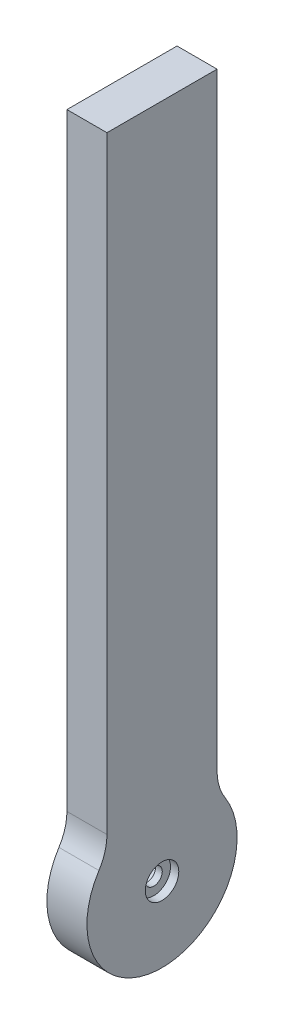
ISO-10303-21;
HEADER;
FILE_DESCRIPTION(('STEP AP214'),'2;1');
FILE_NAME('part.step','',(''),(''),'','','');
FILE_SCHEMA(('AUTOMOTIVE_DESIGN { 1 0 10303 214 1 1 1 1 }'));
ENDSEC;
DATA;
#1=APPLICATION_CONTEXT('core data for automotive mechanical design processes');
#2=APPLICATION_PROTOCOL_DEFINITION('international standard','automotive_design',2000,#1);
#3=PRODUCT_CONTEXT('',#1,'mechanical');
#4=PRODUCT('Part','Part','',(#3));
#5=PRODUCT_RELATED_PRODUCT_CATEGORY('part','',(#4));
#6=PRODUCT_DEFINITION_FORMATION('','',#4);
#7=PRODUCT_DEFINITION_CONTEXT('part definition',#1,'design');
#8=PRODUCT_DEFINITION('design','',#6,#7);
#9=PRODUCT_DEFINITION_SHAPE('','',#8);
#10=(LENGTH_UNIT() NAMED_UNIT(*) SI_UNIT(.MILLI.,.METRE.));
#11=(NAMED_UNIT(*) PLANE_ANGLE_UNIT() SI_UNIT($,.RADIAN.));
#12=(NAMED_UNIT(*) SI_UNIT($,.STERADIAN.) SOLID_ANGLE_UNIT());
#13=UNCERTAINTY_MEASURE_WITH_UNIT(LENGTH_MEASURE(1.E-05),#10,'distance_accuracy_value','');
#14=(GEOMETRIC_REPRESENTATION_CONTEXT(3) GLOBAL_UNCERTAINTY_ASSIGNED_CONTEXT((#13)) GLOBAL_UNIT_ASSIGNED_CONTEXT((#10,
#11,#12)) REPRESENTATION_CONTEXT('',''));
#15=CARTESIAN_POINT('',(0.,0.,0.));
#16=DIRECTION('',(0.,0.,1.));
#17=DIRECTION('',(1.,0.,0.));
#18=AXIS2_PLACEMENT_3D('',#15,#16,#17);
#19=CARTESIAN_POINT('',(8.,0.,0.));
#20=DIRECTION('',(-1.,0.,0.));
#21=DIRECTION('',(0.,0.,1.));
#22=AXIS2_PLACEMENT_3D('',#19,#20,#21);
#23=PLANE('',#22);
#24=DIRECTION('',(0.,1.,0.));
#25=VECTOR('',#24,1.);
#26=CARTESIAN_POINT('',(8.,150.,-33.));
#27=LINE('',#26,#25);
#28=CARTESIAN_POINT('',(8.,28.5646599662505,-33.));
#29=VERTEX_POINT('',#28);
#30=CARTESIAN_POINT('',(8.,150.,-33.));
#31=VERTEX_POINT('',#30);
#32=EDGE_CURVE('E131',#29,#31,#27,.T.);
#33=ORIENTED_EDGE('',*,*,#32,.T.);
#34=DIRECTION('',(0.,0.,-1.));
#35=VECTOR('',#34,1.);
#36=CARTESIAN_POINT('',(8.,150.,0.));
#37=LINE('',#36,#35);
#38=CARTESIAN_POINT('',(8.,150.,-11.));
#39=VERTEX_POINT('',#38);
#40=EDGE_CURVE('E43',#39,#31,#37,.T.);
#41=ORIENTED_EDGE('',*,*,#40,.F.);
#42=DIRECTION('',(0.,-1.,0.));
#43=VECTOR('',#42,1.);
#44=CARTESIAN_POINT('',(8.,150.,-11.));
#45=LINE('',#44,#43);
#46=CARTESIAN_POINT('',(8.,28.5646599662505,-11.));
#47=VERTEX_POINT('',#46);
#48=EDGE_CURVE('E128',#39,#47,#45,.T.);
#49=ORIENTED_EDGE('',*,*,#48,.T.);
#50=CARTESIAN_POINT('',(8.,28.5646599662505,-1.00000000000001));
#51=DIRECTION('',(-1.,0.,0.));
#52=DIRECTION('',(0.,0.,1.));
#53=AXIS2_PLACEMENT_3D('',#50,#51,#52);
#54=CIRCLE('',#53,10.);
#55=CARTESIAN_POINT('',(8.,23.1387959797503,-9.40000000000002));
#56=VERTEX_POINT('',#55);
#57=EDGE_CURVE('E146',#47,#56,#54,.T.);
#58=ORIENTED_EDGE('',*,*,#57,.T.);
#59=CARTESIAN_POINT('',(8.,15.,-22.));
#60=DIRECTION('',(-1.,0.,0.));
#61=DIRECTION('',(0.,0.,1.));
#62=AXIS2_PLACEMENT_3D('',#59,#60,#61);
#63=CIRCLE('',#62,15.);
#64=CARTESIAN_POINT('',(8.,23.1387959797503,-34.6));
#65=VERTEX_POINT('',#64);
#66=EDGE_CURVE('E11',#65,#56,#63,.T.);
#67=ORIENTED_EDGE('',*,*,#66,.F.);
#68=CARTESIAN_POINT('',(8.,28.5646599662505,-43.));
#69=DIRECTION('',(-1.,0.,0.));
#70=DIRECTION('',(0.,0.,-1.));
#71=AXIS2_PLACEMENT_3D('',#68,#69,#70);
#72=CIRCLE('',#71,9.99999999999999);
#73=EDGE_CURVE('E148',#65,#29,#72,.T.);
#74=ORIENTED_EDGE('',*,*,#73,.T.);
#75=EDGE_LOOP('',(#33,#41,#49,#58,#67,#74));
#76=FACE_BOUND('',#75,.T.);
#77=CARTESIAN_POINT('',(8.,15.,-22.));
#78=DIRECTION('',(1.,0.,0.));
#79=DIRECTION('',(0.,0.,-1.));
#80=AXIS2_PLACEMENT_3D('',#77,#78,#79);
#81=CIRCLE('',#80,3.35);
#82=CARTESIAN_POINT('',(8.,15.,-25.35));
#83=VERTEX_POINT('',#82);
#84=EDGE_CURVE('E236',#83,#83,#81,.T.);
#85=ORIENTED_EDGE('',*,*,#84,.F.);
#86=EDGE_LOOP('',(#85));
#87=FACE_BOUND('',#86,.T.);
#88=ADVANCED_FACE('F35',(#76,#87),#23,.F.);
#89=CARTESIAN_POINT('',(0.,0.,0.));
#90=DIRECTION('',(-1.,0.,0.));
#91=DIRECTION('',(0.,0.,1.));
#92=AXIS2_PLACEMENT_3D('',#89,#90,#91);
#93=PLANE('',#92);
#94=DIRECTION('',(0.,0.,-1.));
#95=VECTOR('',#94,1.);
#96=CARTESIAN_POINT('',(0.,150.,0.));
#97=LINE('',#96,#95);
#98=CARTESIAN_POINT('',(0.,150.,-11.));
#99=VERTEX_POINT('',#98);
#100=CARTESIAN_POINT('',(0.,150.,-33.));
#101=VERTEX_POINT('',#100);
#102=EDGE_CURVE('E134',#99,#101,#97,.T.);
#103=ORIENTED_EDGE('',*,*,#102,.T.);
#104=DIRECTION('',(0.,1.,0.));
#105=VECTOR('',#104,1.);
#106=CARTESIAN_POINT('',(0.,150.,-33.));
#107=LINE('',#106,#105);
#108=CARTESIAN_POINT('',(0.,28.5646599662505,-33.));
#109=VERTEX_POINT('',#108);
#110=EDGE_CURVE('E50',#109,#101,#107,.T.);
#111=ORIENTED_EDGE('',*,*,#110,.F.);
#112=CARTESIAN_POINT('',(0.,28.5646599662505,-43.));
#113=DIRECTION('',(-1.,0.,0.));
#114=DIRECTION('',(0.,0.,1.));
#115=AXIS2_PLACEMENT_3D('',#112,#113,#114);
#116=CIRCLE('',#115,9.99999999999999);
#117=CARTESIAN_POINT('',(0.,23.1387959797503,-34.6));
#118=VERTEX_POINT('',#117);
#119=EDGE_CURVE('E150',#118,#109,#116,.T.);
#120=ORIENTED_EDGE('',*,*,#119,.F.);
#121=CARTESIAN_POINT('',(0.,15.,-22.));
#122=DIRECTION('',(-1.,0.,0.));
#123=DIRECTION('',(0.,0.,1.));
#124=AXIS2_PLACEMENT_3D('',#121,#122,#123);
#125=CIRCLE('',#124,15.);
#126=CARTESIAN_POINT('',(0.,23.1387959797503,-9.40000000000002));
#127=VERTEX_POINT('',#126);
#128=EDGE_CURVE('E58',#127,#118,#125,.F.);
#129=ORIENTED_EDGE('',*,*,#128,.F.);
#130=CARTESIAN_POINT('',(0.,28.5646599662505,-1.00000000000001));
#131=DIRECTION('',(-1.,0.,0.));
#132=DIRECTION('',(0.,0.,1.));
#133=AXIS2_PLACEMENT_3D('',#130,#131,#132);
#134=CIRCLE('',#133,10.);
#135=CARTESIAN_POINT('',(0.,28.5646599662505,-11.));
#136=VERTEX_POINT('',#135);
#137=EDGE_CURVE('E222',#136,#127,#134,.T.);
#138=ORIENTED_EDGE('',*,*,#137,.F.);
#139=DIRECTION('',(0.,-1.,0.));
#140=VECTOR('',#139,1.);
#141=CARTESIAN_POINT('',(0.,150.,-11.));
#142=LINE('',#141,#140);
#143=EDGE_CURVE('E158',#99,#136,#142,.T.);
#144=ORIENTED_EDGE('',*,*,#143,.F.);
#145=EDGE_LOOP('',(#103,#111,#120,#129,#138,#144));
#146=FACE_BOUND('',#145,.T.);
#147=DIRECTION('',(0.,1.,0.));
#148=VECTOR('',#147,1.);
#149=CARTESIAN_POINT('',(0.,13.,-25.4641016151378));
#150=LINE('',#149,#148);
#151=CARTESIAN_POINT('',(0.,13.,-25.4641016151378));
#152=VERTEX_POINT('',#151);
#153=CARTESIAN_POINT('',(0.,17.,-25.4641016151378));
#154=VERTEX_POINT('',#153);
#155=EDGE_CURVE('E174',#152,#154,#150,.T.);
#156=ORIENTED_EDGE('',*,*,#155,.T.);
#157=DIRECTION('',(0.,0.5,0.866025403784439));
#158=VECTOR('',#157,1.);
#159=CARTESIAN_POINT('',(0.,17.,-25.4641016151378));
#160=LINE('',#159,#158);
#161=CARTESIAN_POINT('',(0.,19.,-22.));
#162=VERTEX_POINT('',#161);
#163=EDGE_CURVE('E169',#154,#162,#160,.T.);
#164=ORIENTED_EDGE('',*,*,#163,.T.);
#165=DIRECTION('',(0.,-0.499999999999999,0.866025403784439));
#166=VECTOR('',#165,1.);
#167=CARTESIAN_POINT('',(0.,19.,-22.));
#168=LINE('',#167,#166);
#169=CARTESIAN_POINT('',(0.,17.,-18.5358983848622));
#170=VERTEX_POINT('',#169);
#171=EDGE_CURVE('E187',#162,#170,#168,.T.);
#172=ORIENTED_EDGE('',*,*,#171,.T.);
#173=DIRECTION('',(0.,-1.,0.));
#174=VECTOR('',#173,1.);
#175=CARTESIAN_POINT('',(0.,17.,-18.5358983848622));
#176=LINE('',#175,#174);
#177=CARTESIAN_POINT('',(0.,13.,-18.5358983848622));
#178=VERTEX_POINT('',#177);
#179=EDGE_CURVE('E190',#170,#178,#176,.T.);
#180=ORIENTED_EDGE('',*,*,#179,.T.);
#181=DIRECTION('',(0.,-0.500000000000001,-0.866025403784438));
#182=VECTOR('',#181,1.);
#183=CARTESIAN_POINT('',(0.,13.,-18.5358983848622));
#184=LINE('',#183,#182);
#185=CARTESIAN_POINT('',(0.,11.,-22.));
#186=VERTEX_POINT('',#185);
#187=EDGE_CURVE('E193',#178,#186,#184,.T.);
#188=ORIENTED_EDGE('',*,*,#187,.T.);
#189=DIRECTION('',(0.,0.499999999999999,-0.866025403784439));
#190=VECTOR('',#189,1.);
#191=CARTESIAN_POINT('',(0.,11.,-22.));
#192=LINE('',#191,#190);
#193=EDGE_CURVE('E196',#186,#152,#192,.T.);
#194=ORIENTED_EDGE('',*,*,#193,.T.);
#195=EDGE_LOOP('',(#156,#164,#172,#180,#188,#194));
#196=FACE_BOUND('',#195,.T.);
#197=ADVANCED_FACE('F213',(#146,#196),#93,.T.);
#198=CARTESIAN_POINT('',(8.,150.,0.));
#199=DIRECTION('',(0.,1.,0.));
#200=DIRECTION('',(0.,0.,1.));
#201=AXIS2_PLACEMENT_3D('',#198,#199,#200);
#202=PLANE('',#201);
#203=ORIENTED_EDGE('',*,*,#40,.T.);
#204=DIRECTION('',(1.,0.,0.));
#205=VECTOR('',#204,1.);
#206=CARTESIAN_POINT('',(-0.000999999999999265,150.,-33.));
#207=LINE('',#206,#205);
#208=EDGE_CURVE('E156',#101,#31,#207,.T.);
#209=ORIENTED_EDGE('',*,*,#208,.F.);
#210=ORIENTED_EDGE('',*,*,#102,.F.);
#211=DIRECTION('',(1.,0.,0.));
#212=VECTOR('',#211,1.);
#213=CARTESIAN_POINT('',(-0.000999999999999265,150.,-11.));
#214=LINE('',#213,#212);
#215=EDGE_CURVE('E138',#99,#39,#214,.T.);
#216=ORIENTED_EDGE('',*,*,#215,.T.);
#217=EDGE_LOOP('',(#203,#209,#210,#216));
#218=FACE_BOUND('',#217,.T.);
#219=ADVANCED_FACE('F37',(#218),#202,.T.);
#220=CARTESIAN_POINT('',(5.,17.,-25.4641016151378));
#221=DIRECTION('',(0.,-0.866025403784439,0.5));
#222=DIRECTION('',(0.,-0.5,-0.866025403784439));
#223=AXIS2_PLACEMENT_3D('',#220,#221,#222);
#224=PLANE('',#223);
#225=ORIENTED_EDGE('',*,*,#163,.F.);
#226=DIRECTION('',(-1.,0.,0.));
#227=VECTOR('',#226,1.);
#228=CARTESIAN_POINT('',(5.,17.,-25.4641016151378));
#229=LINE('',#228,#227);
#230=CARTESIAN_POINT('',(5.,17.,-25.4641016151378));
#231=VERTEX_POINT('',#230);
#232=EDGE_CURVE('E184',#231,#154,#229,.T.);
#233=ORIENTED_EDGE('',*,*,#232,.F.);
#234=DIRECTION('',(0.,0.5,0.866025403784439));
#235=VECTOR('',#234,1.);
#236=CARTESIAN_POINT('',(5.,17.,-25.4641016151378));
#237=LINE('',#236,#235);
#238=CARTESIAN_POINT('',(5.,19.,-22.));
#239=VERTEX_POINT('',#238);
#240=EDGE_CURVE('E170',#231,#239,#237,.T.);
#241=ORIENTED_EDGE('',*,*,#240,.T.);
#242=DIRECTION('',(-1.,0.,0.));
#243=VECTOR('',#242,1.);
#244=CARTESIAN_POINT('',(5.,19.,-22.));
#245=LINE('',#244,#243);
#246=EDGE_CURVE('E211',#239,#162,#245,.T.);
#247=ORIENTED_EDGE('',*,*,#246,.T.);
#248=EDGE_LOOP('',(#225,#233,#241,#247));
#249=FACE_BOUND('',#248,.T.);
#250=ADVANCED_FACE('F247',(#249),#224,.T.);
#251=CARTESIAN_POINT('',(5.,19.,-22.));
#252=DIRECTION('',(0.,-0.866025403784439,-0.499999999999999));
#253=DIRECTION('',(0.,0.499999999999999,-0.866025403784439));
#254=AXIS2_PLACEMENT_3D('',#251,#252,#253);
#255=PLANE('',#254);
#256=ORIENTED_EDGE('',*,*,#171,.F.);
#257=ORIENTED_EDGE('',*,*,#246,.F.);
#258=DIRECTION('',(0.,-0.499999999999999,0.866025403784439));
#259=VECTOR('',#258,1.);
#260=CARTESIAN_POINT('',(5.,19.,-22.));
#261=LINE('',#260,#259);
#262=CARTESIAN_POINT('',(5.,17.,-18.5358983848622));
#263=VERTEX_POINT('',#262);
#264=EDGE_CURVE('E173',#239,#263,#261,.T.);
#265=ORIENTED_EDGE('',*,*,#264,.T.);
#266=DIRECTION('',(-1.,0.,0.));
#267=VECTOR('',#266,1.);
#268=CARTESIAN_POINT('',(5.,17.,-18.5358983848622));
#269=LINE('',#268,#267);
#270=EDGE_CURVE('E209',#263,#170,#269,.T.);
#271=ORIENTED_EDGE('',*,*,#270,.T.);
#272=EDGE_LOOP('',(#256,#257,#265,#271));
#273=FACE_BOUND('',#272,.T.);
#274=ADVANCED_FACE('F250',(#273),#255,.T.);
#275=CARTESIAN_POINT('',(5.,17.,-18.5358983848622));
#276=DIRECTION('',(0.,0.,-1.));
#277=DIRECTION('',(0.,1.,0.));
#278=AXIS2_PLACEMENT_3D('',#275,#276,#277);
#279=PLANE('',#278);
#280=ORIENTED_EDGE('',*,*,#179,.F.);
#281=ORIENTED_EDGE('',*,*,#270,.F.);
#282=DIRECTION('',(0.,-1.,0.));
#283=VECTOR('',#282,1.);
#284=CARTESIAN_POINT('',(5.,17.,-18.5358983848622));
#285=LINE('',#284,#283);
#286=CARTESIAN_POINT('',(5.,13.,-18.5358983848622));
#287=VERTEX_POINT('',#286);
#288=EDGE_CURVE('E176',#263,#287,#285,.T.);
#289=ORIENTED_EDGE('',*,*,#288,.T.);
#290=DIRECTION('',(-1.,0.,0.));
#291=VECTOR('',#290,1.);
#292=CARTESIAN_POINT('',(5.,13.,-18.5358983848622));
#293=LINE('',#292,#291);
#294=EDGE_CURVE('E207',#287,#178,#293,.T.);
#295=ORIENTED_EDGE('',*,*,#294,.T.);
#296=EDGE_LOOP('',(#280,#281,#289,#295));
#297=FACE_BOUND('',#296,.T.);
#298=ADVANCED_FACE('F254',(#297),#279,.T.);
#299=CARTESIAN_POINT('',(5.,13.,-18.5358983848622));
#300=DIRECTION('',(0.,0.866025403784438,-0.500000000000001));
#301=DIRECTION('',(0.,0.500000000000001,0.866025403784438));
#302=AXIS2_PLACEMENT_3D('',#299,#300,#301);
#303=PLANE('',#302);
#304=ORIENTED_EDGE('',*,*,#187,.F.);
#305=ORIENTED_EDGE('',*,*,#294,.F.);
#306=DIRECTION('',(0.,-0.500000000000001,-0.866025403784438));
#307=VECTOR('',#306,1.);
#308=CARTESIAN_POINT('',(5.,13.,-18.5358983848622));
#309=LINE('',#308,#307);
#310=CARTESIAN_POINT('',(5.,11.,-22.));
#311=VERTEX_POINT('',#310);
#312=EDGE_CURVE('E178',#287,#311,#309,.T.);
#313=ORIENTED_EDGE('',*,*,#312,.T.);
#314=DIRECTION('',(-1.,0.,0.));
#315=VECTOR('',#314,1.);
#316=CARTESIAN_POINT('',(5.,11.,-22.));
#317=LINE('',#316,#315);
#318=EDGE_CURVE('E205',#311,#186,#317,.T.);
#319=ORIENTED_EDGE('',*,*,#318,.T.);
#320=EDGE_LOOP('',(#304,#305,#313,#319));
#321=FACE_BOUND('',#320,.T.);
#322=ADVANCED_FACE('F258',(#321),#303,.T.);
#323=CARTESIAN_POINT('',(5.,11.,-22.));
#324=DIRECTION('',(0.,0.866025403784439,0.499999999999999));
#325=DIRECTION('',(0.,-0.499999999999999,0.866025403784439));
#326=AXIS2_PLACEMENT_3D('',#323,#324,#325);
#327=PLANE('',#326);
#328=ORIENTED_EDGE('',*,*,#193,.F.);
#329=ORIENTED_EDGE('',*,*,#318,.F.);
#330=DIRECTION('',(0.,0.499999999999999,-0.866025403784439));
#331=VECTOR('',#330,1.);
#332=CARTESIAN_POINT('',(5.,11.,-22.));
#333=LINE('',#332,#331);
#334=CARTESIAN_POINT('',(5.,13.,-25.4641016151378));
#335=VERTEX_POINT('',#334);
#336=EDGE_CURVE('E180',#311,#335,#333,.T.);
#337=ORIENTED_EDGE('',*,*,#336,.T.);
#338=DIRECTION('',(-1.,0.,0.));
#339=VECTOR('',#338,1.);
#340=CARTESIAN_POINT('',(5.,13.,-25.4641016151378));
#341=LINE('',#340,#339);
#342=EDGE_CURVE('E203',#335,#152,#341,.T.);
#343=ORIENTED_EDGE('',*,*,#342,.T.);
#344=EDGE_LOOP('',(#328,#329,#337,#343));
#345=FACE_BOUND('',#344,.T.);
#346=ADVANCED_FACE('F262',(#345),#327,.T.);
#347=CARTESIAN_POINT('',(5.,13.,-25.4641016151378));
#348=DIRECTION('',(0.,0.,1.));
#349=DIRECTION('',(0.,-1.,0.));
#350=AXIS2_PLACEMENT_3D('',#347,#348,#349);
#351=PLANE('',#350);
#352=ORIENTED_EDGE('',*,*,#155,.F.);
#353=ORIENTED_EDGE('',*,*,#342,.F.);
#354=DIRECTION('',(0.,1.,0.));
#355=VECTOR('',#354,1.);
#356=CARTESIAN_POINT('',(5.,13.,-25.4641016151378));
#357=LINE('',#356,#355);
#358=EDGE_CURVE('E182',#335,#231,#357,.T.);
#359=ORIENTED_EDGE('',*,*,#358,.T.);
#360=ORIENTED_EDGE('',*,*,#232,.T.);
#361=EDGE_LOOP('',(#352,#353,#359,#360));
#362=FACE_BOUND('',#361,.T.);
#363=ADVANCED_FACE('F266',(#362),#351,.T.);
#364=CARTESIAN_POINT('',(5.,0.,0.));
#365=DIRECTION('',(1.,0.,0.));
#366=DIRECTION('',(0.,0.,-1.));
#367=AXIS2_PLACEMENT_3D('',#364,#365,#366);
#368=PLANE('',#367);
#369=CARTESIAN_POINT('',(5.,15.,-22.));
#370=DIRECTION('',(1.,0.,0.));
#371=DIRECTION('',(0.,0.,-1.));
#372=AXIS2_PLACEMENT_3D('',#369,#370,#371);
#373=CIRCLE('',#372,1.7);
#374=CARTESIAN_POINT('',(5.,15.,-23.7));
#375=VERTEX_POINT('',#374);
#376=EDGE_CURVE('E227',#375,#375,#373,.T.);
#377=ORIENTED_EDGE('',*,*,#376,.T.);
#378=EDGE_LOOP('',(#377));
#379=FACE_BOUND('',#378,.T.);
#380=ORIENTED_EDGE('',*,*,#240,.F.);
#381=ORIENTED_EDGE('',*,*,#358,.F.);
#382=ORIENTED_EDGE('',*,*,#336,.F.);
#383=ORIENTED_EDGE('',*,*,#312,.F.);
#384=ORIENTED_EDGE('',*,*,#288,.F.);
#385=ORIENTED_EDGE('',*,*,#264,.F.);
#386=EDGE_LOOP('',(#380,#381,#382,#383,#384,#385));
#387=FACE_BOUND('',#386,.T.);
#388=ADVANCED_FACE('F270',(#379,#387),#368,.F.);
#389=CARTESIAN_POINT('',(-0.000999999999999265,15.,-22.));
#390=DIRECTION('',(1.,0.,0.));
#391=DIRECTION('',(0.,0.,-1.));
#392=AXIS2_PLACEMENT_3D('',#389,#390,#391);
#393=CYLINDRICAL_SURFACE('',#392,15.);
#394=ORIENTED_EDGE('',*,*,#128,.T.);
#395=DIRECTION('',(1.,0.,0.));
#396=VECTOR('',#395,1.);
#397=CARTESIAN_POINT('',(-0.000999999999999265,23.1387959797503,-34.6));
#398=LINE('',#397,#396);
#399=EDGE_CURVE('E162',#118,#65,#398,.T.);
#400=ORIENTED_EDGE('',*,*,#399,.T.);
#401=ORIENTED_EDGE('',*,*,#66,.T.);
#402=DIRECTION('',(1.,0.,0.));
#403=VECTOR('',#402,1.);
#404=CARTESIAN_POINT('',(-0.000999999999999265,23.1387959797503,-9.40000000000002));
#405=LINE('',#404,#403);
#406=EDGE_CURVE('E164',#127,#56,#405,.T.);
#407=ORIENTED_EDGE('',*,*,#406,.F.);
#408=EDGE_LOOP('',(#394,#400,#401,#407));
#409=FACE_BOUND('',#408,.T.);
#410=ADVANCED_FACE('F274',(#409),#393,.T.);
#411=CARTESIAN_POINT('',(-0.000999999999999265,150.,-33.));
#412=DIRECTION('',(0.,0.,-1.));
#413=DIRECTION('',(0.,1.,0.));
#414=AXIS2_PLACEMENT_3D('',#411,#412,#413);
#415=PLANE('',#414);
#416=DIRECTION('',(1.,0.,0.));
#417=VECTOR('',#416,1.);
#418=CARTESIAN_POINT('',(-0.000999999999999265,28.5646599662505,-33.));
#419=LINE('',#418,#417);
#420=EDGE_CURVE('E159',#109,#29,#419,.T.);
#421=ORIENTED_EDGE('',*,*,#420,.F.);
#422=ORIENTED_EDGE('',*,*,#110,.T.);
#423=ORIENTED_EDGE('',*,*,#208,.T.);
#424=ORIENTED_EDGE('',*,*,#32,.F.);
#425=EDGE_LOOP('',(#421,#422,#423,#424));
#426=FACE_BOUND('',#425,.T.);
#427=ADVANCED_FACE('F217',(#426),#415,.T.);
#428=CARTESIAN_POINT('',(-0.000999999999999265,28.5646599662505,-43.));
#429=DIRECTION('',(1.,0.,0.));
#430=DIRECTION('',(0.,0.,-1.));
#431=AXIS2_PLACEMENT_3D('',#428,#429,#430);
#432=CYLINDRICAL_SURFACE('',#431,9.99999999999999);
#433=ORIENTED_EDGE('',*,*,#399,.F.);
#434=ORIENTED_EDGE('',*,*,#119,.T.);
#435=ORIENTED_EDGE('',*,*,#420,.T.);
#436=ORIENTED_EDGE('',*,*,#73,.F.);
#437=EDGE_LOOP('',(#433,#434,#435,#436));
#438=FACE_BOUND('',#437,.T.);
#439=ADVANCED_FACE('F221',(#438),#432,.F.);
#440=CARTESIAN_POINT('',(-0.000999999999999265,28.5646599662505,-1.00000000000001));
#441=DIRECTION('',(1.,0.,0.));
#442=DIRECTION('',(0.,0.,-1.));
#443=AXIS2_PLACEMENT_3D('',#440,#441,#442);
#444=CYLINDRICAL_SURFACE('',#443,10.);
#445=DIRECTION('',(1.,0.,0.));
#446=VECTOR('',#445,1.);
#447=CARTESIAN_POINT('',(-0.000999999999999265,28.5646599662505,-11.));
#448=LINE('',#447,#446);
#449=EDGE_CURVE('E141',#136,#47,#448,.T.);
#450=ORIENTED_EDGE('',*,*,#449,.F.);
#451=ORIENTED_EDGE('',*,*,#137,.T.);
#452=ORIENTED_EDGE('',*,*,#406,.T.);
#453=ORIENTED_EDGE('',*,*,#57,.F.);
#454=EDGE_LOOP('',(#450,#451,#452,#453));
#455=FACE_BOUND('',#454,.T.);
#456=ADVANCED_FACE('F279',(#455),#444,.F.);
#457=CARTESIAN_POINT('',(-0.000999999999999265,150.,-11.));
#458=DIRECTION('',(0.,0.,1.));
#459=DIRECTION('',(0.,-1.,0.));
#460=AXIS2_PLACEMENT_3D('',#457,#458,#459);
#461=PLANE('',#460);
#462=ORIENTED_EDGE('',*,*,#215,.F.);
#463=ORIENTED_EDGE('',*,*,#143,.T.);
#464=ORIENTED_EDGE('',*,*,#449,.T.);
#465=ORIENTED_EDGE('',*,*,#48,.F.);
#466=EDGE_LOOP('',(#462,#463,#464,#465));
#467=FACE_BOUND('',#466,.T.);
#468=ADVANCED_FACE('F143',(#467),#461,.T.);
#469=CARTESIAN_POINT('',(8.,15.,-22.));
#470=DIRECTION('',(1.,0.,0.));
#471=DIRECTION('',(0.,0.,-1.));
#472=AXIS2_PLACEMENT_3D('',#469,#470,#471);
#473=CYLINDRICAL_SURFACE('',#472,1.7);
#474=ORIENTED_EDGE('',*,*,#376,.F.);
#475=EDGE_LOOP('',(#474));
#476=FACE_BOUND('',#475,.T.);
#477=CARTESIAN_POINT('',(6.35,15.,-22.));
#478=DIRECTION('',(1.,0.,0.));
#479=DIRECTION('',(0.,0.,-1.));
#480=AXIS2_PLACEMENT_3D('',#477,#478,#479);
#481=CIRCLE('',#480,1.7);
#482=CARTESIAN_POINT('',(6.35,15.,-23.7));
#483=VERTEX_POINT('',#482);
#484=EDGE_CURVE('E230',#483,#483,#481,.T.);
#485=ORIENTED_EDGE('',*,*,#484,.T.);
#486=EDGE_LOOP('',(#485));
#487=FACE_BOUND('',#486,.T.);
#488=ADVANCED_FACE('F278',(#476,#487),#473,.F.);
#489=CARTESIAN_POINT('',(6.35,16.7,-22.));
#490=DIRECTION('',(-1.,0.,0.));
#491=DIRECTION('',(0.,0.,1.));
#492=AXIS2_PLACEMENT_3D('',#489,#490,#491);
#493=PLANE('',#492);
#494=ORIENTED_EDGE('',*,*,#484,.F.);
#495=EDGE_LOOP('',(#494));
#496=FACE_BOUND('',#495,.T.);
#497=CARTESIAN_POINT('',(6.35,15.,-22.));
#498=DIRECTION('',(1.,0.,0.));
#499=DIRECTION('',(0.,0.,-1.));
#500=AXIS2_PLACEMENT_3D('',#497,#498,#499);
#501=CIRCLE('',#500,3.35);
#502=CARTESIAN_POINT('',(6.35,15.,-25.35));
#503=VERTEX_POINT('',#502);
#504=EDGE_CURVE('E233',#503,#503,#501,.T.);
#505=ORIENTED_EDGE('',*,*,#504,.T.);
#506=EDGE_LOOP('',(#505));
#507=FACE_BOUND('',#506,.T.);
#508=ADVANCED_FACE('F291',(#496,#507),#493,.F.);
#509=CARTESIAN_POINT('',(8.,15.,-22.));
#510=DIRECTION('',(1.,0.,0.));
#511=DIRECTION('',(0.,0.,-1.));
#512=AXIS2_PLACEMENT_3D('',#509,#510,#511);
#513=CYLINDRICAL_SURFACE('',#512,3.35);
#514=ORIENTED_EDGE('',*,*,#504,.F.);
#515=EDGE_LOOP('',(#514));
#516=FACE_BOUND('',#515,.T.);
#517=ORIENTED_EDGE('',*,*,#84,.T.);
#518=EDGE_LOOP('',(#517));
#519=FACE_BOUND('',#518,.T.);
#520=ADVANCED_FACE('F240',(#516,#519),#513,.F.);
#521=CLOSED_SHELL('',(#88,#197,#219,#250,#274,#298,#322,#346,#363,#388,#410,#427,#439,#456,#468,
#488,#508,#520));
#522=MANIFOLD_SOLID_BREP('B2',#521);
#523=ADVANCED_BREP_SHAPE_REPRESENTATION('',(#18,#522),#14);
#524=SHAPE_DEFINITION_REPRESENTATION(#9,#523);
ENDSEC;
END-ISO-10303-21;
